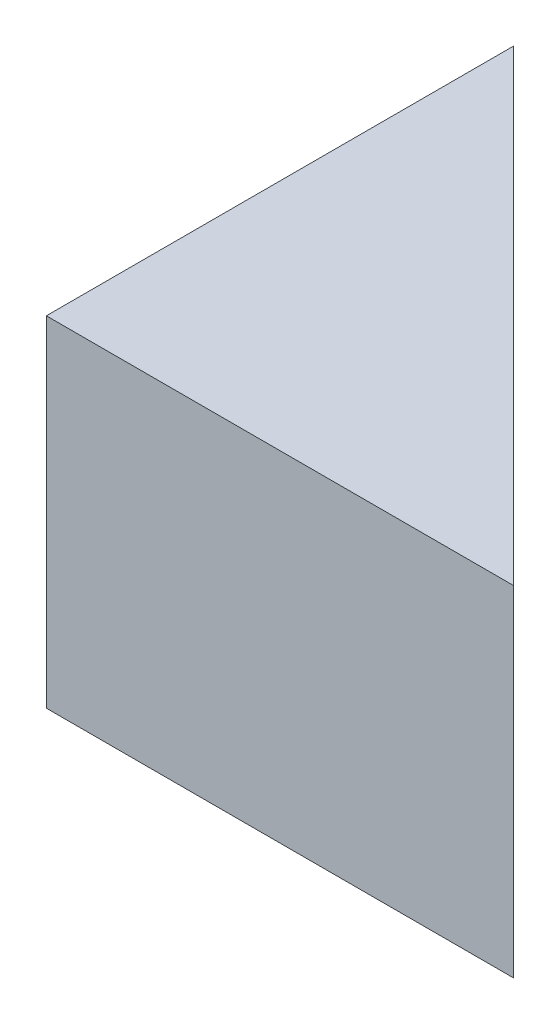
ISO-10303-21;
HEADER;
FILE_DESCRIPTION(('STEP AP214'),'2;1');
FILE_NAME('part.step','',(''),(''),'','','');
FILE_SCHEMA(('AUTOMOTIVE_DESIGN { 1 0 10303 214 1 1 1 1 }'));
ENDSEC;
DATA;
#1=APPLICATION_CONTEXT('core data for automotive mechanical design processes');
#2=APPLICATION_PROTOCOL_DEFINITION('international standard','automotive_design',2000,#1);
#3=PRODUCT_CONTEXT('',#1,'mechanical');
#4=PRODUCT('Part','Part','',(#3));
#5=PRODUCT_RELATED_PRODUCT_CATEGORY('part','',(#4));
#6=PRODUCT_DEFINITION_FORMATION('','',#4);
#7=PRODUCT_DEFINITION_CONTEXT('part definition',#1,'design');
#8=PRODUCT_DEFINITION('design','',#6,#7);
#9=PRODUCT_DEFINITION_SHAPE('','',#8);
#10=(LENGTH_UNIT() NAMED_UNIT(*) SI_UNIT(.MILLI.,.METRE.));
#11=(NAMED_UNIT(*) PLANE_ANGLE_UNIT() SI_UNIT($,.RADIAN.));
#12=(NAMED_UNIT(*) SI_UNIT($,.STERADIAN.) SOLID_ANGLE_UNIT());
#13=UNCERTAINTY_MEASURE_WITH_UNIT(LENGTH_MEASURE(1.E-05),#10,'distance_accuracy_value','');
#14=(GEOMETRIC_REPRESENTATION_CONTEXT(3) GLOBAL_UNCERTAINTY_ASSIGNED_CONTEXT((#13)) GLOBAL_UNIT_ASSIGNED_CONTEXT((#10,
#11,#12)) REPRESENTATION_CONTEXT('',''));
#15=CARTESIAN_POINT('',(0.,0.,0.));
#16=DIRECTION('',(0.,0.,1.));
#17=DIRECTION('',(1.,0.,0.));
#18=AXIS2_PLACEMENT_3D('',#15,#16,#17);
#19=CARTESIAN_POINT('',(27.5,20.,0.));
#20=DIRECTION('',(0.,0.,-1.));
#21=DIRECTION('',(-1.,0.,0.));
#22=AXIS2_PLACEMENT_3D('',#19,#20,#21);
#23=PLANE('',#22);
#24=DIRECTION('',(1.,0.,0.));
#25=VECTOR('',#24,1.);
#26=CARTESIAN_POINT('',(27.5,0.,0.));
#27=LINE('',#26,#25);
#28=CARTESIAN_POINT('',(0.,0.,0.));
#29=VERTEX_POINT('',#28);
#30=CARTESIAN_POINT('',(27.5,0.,0.));
#31=VERTEX_POINT('',#30);
#32=EDGE_CURVE('E89',#29,#31,#27,.T.);
#33=ORIENTED_EDGE('',*,*,#32,.T.);
#34=DIRECTION('',(0.,-1.,0.));
#35=VECTOR('',#34,1.);
#36=CARTESIAN_POINT('',(27.5,20.,0.));
#37=LINE('',#36,#35);
#38=CARTESIAN_POINT('',(27.5,20.,0.));
#39=VERTEX_POINT('',#38);
#40=EDGE_CURVE('E11',#39,#31,#37,.T.);
#41=ORIENTED_EDGE('',*,*,#40,.F.);
#42=DIRECTION('',(1.,0.,0.));
#43=VECTOR('',#42,1.);
#44=CARTESIAN_POINT('',(27.5,20.,0.));
#45=LINE('',#44,#43);
#46=CARTESIAN_POINT('',(0.,20.,0.));
#47=VERTEX_POINT('',#46);
#48=EDGE_CURVE('E81',#47,#39,#45,.T.);
#49=ORIENTED_EDGE('',*,*,#48,.F.);
#50=DIRECTION('',(0.,-1.,0.));
#51=VECTOR('',#50,1.);
#52=CARTESIAN_POINT('',(0.,20.,0.));
#53=LINE('',#52,#51);
#54=EDGE_CURVE('E90',#47,#29,#53,.T.);
#55=ORIENTED_EDGE('',*,*,#54,.T.);
#56=EDGE_LOOP('',(#33,#41,#49,#55));
#57=FACE_BOUND('',#56,.T.);
#58=ADVANCED_FACE('F39',(#57),#23,.F.);
#59=CARTESIAN_POINT('',(0.,20.,-27.5));
#60=DIRECTION('',(-0.707106781186548,0.,0.707106781186548));
#61=DIRECTION('',(0.707106781186548,0.,0.707106781186548));
#62=AXIS2_PLACEMENT_3D('',#59,#60,#61);
#63=PLANE('',#62);
#64=DIRECTION('',(-0.707106781186548,0.,-0.707106781186548));
#65=VECTOR('',#64,1.);
#66=CARTESIAN_POINT('',(0.,0.,-27.5));
#67=LINE('',#66,#65);
#68=CARTESIAN_POINT('',(0.,0.,-27.5));
#69=VERTEX_POINT('',#68);
#70=EDGE_CURVE('E68',#31,#69,#67,.T.);
#71=ORIENTED_EDGE('',*,*,#70,.T.);
#72=DIRECTION('',(0.,-1.,0.));
#73=VECTOR('',#72,1.);
#74=CARTESIAN_POINT('',(0.,20.,-27.5));
#75=LINE('',#74,#73);
#76=CARTESIAN_POINT('',(0.,20.,-27.5));
#77=VERTEX_POINT('',#76);
#78=EDGE_CURVE('E48',#77,#69,#75,.T.);
#79=ORIENTED_EDGE('',*,*,#78,.F.);
#80=DIRECTION('',(-0.707106781186548,0.,-0.707106781186548));
#81=VECTOR('',#80,1.);
#82=CARTESIAN_POINT('',(0.,20.,-27.5));
#83=LINE('',#82,#81);
#84=EDGE_CURVE('E76',#39,#77,#83,.T.);
#85=ORIENTED_EDGE('',*,*,#84,.F.);
#86=ORIENTED_EDGE('',*,*,#40,.T.);
#87=EDGE_LOOP('',(#71,#79,#85,#86));
#88=FACE_BOUND('',#87,.T.);
#89=ADVANCED_FACE('F77',(#88),#63,.F.);
#90=CARTESIAN_POINT('',(0.,20.,0.));
#91=DIRECTION('',(1.,0.,0.));
#92=DIRECTION('',(0.,0.,-1.));
#93=AXIS2_PLACEMENT_3D('',#90,#91,#92);
#94=PLANE('',#93);
#95=DIRECTION('',(0.,0.,1.));
#96=VECTOR('',#95,1.);
#97=CARTESIAN_POINT('',(0.,0.,0.));
#98=LINE('',#97,#96);
#99=EDGE_CURVE('E73',#69,#29,#98,.T.);
#100=ORIENTED_EDGE('',*,*,#99,.T.);
#101=ORIENTED_EDGE('',*,*,#54,.F.);
#102=DIRECTION('',(0.,0.,1.));
#103=VECTOR('',#102,1.);
#104=CARTESIAN_POINT('',(0.,20.,0.));
#105=LINE('',#104,#103);
#106=EDGE_CURVE('E56',#77,#47,#105,.T.);
#107=ORIENTED_EDGE('',*,*,#106,.F.);
#108=ORIENTED_EDGE('',*,*,#78,.T.);
#109=EDGE_LOOP('',(#100,#101,#107,#108));
#110=FACE_BOUND('',#109,.T.);
#111=ADVANCED_FACE('F102',(#110),#94,.F.);
#112=CARTESIAN_POINT('',(0.,20.,0.));
#113=DIRECTION('',(0.,-1.,0.));
#114=DIRECTION('',(0.,0.,-1.));
#115=AXIS2_PLACEMENT_3D('',#112,#113,#114);
#116=PLANE('',#115);
#117=ORIENTED_EDGE('',*,*,#48,.T.);
#118=ORIENTED_EDGE('',*,*,#84,.T.);
#119=ORIENTED_EDGE('',*,*,#106,.T.);
#120=EDGE_LOOP('',(#117,#118,#119));
#121=FACE_BOUND('',#120,.T.);
#122=ADVANCED_FACE('F84',(#121),#116,.F.);
#123=CARTESIAN_POINT('',(0.,0.,0.));
#124=DIRECTION('',(0.,-1.,0.));
#125=DIRECTION('',(0.,0.,-1.));
#126=AXIS2_PLACEMENT_3D('',#123,#124,#125);
#127=PLANE('',#126);
#128=ORIENTED_EDGE('',*,*,#32,.F.);
#129=ORIENTED_EDGE('',*,*,#99,.F.);
#130=ORIENTED_EDGE('',*,*,#70,.F.);
#131=EDGE_LOOP('',(#128,#129,#130));
#132=FACE_BOUND('',#131,.T.);
#133=ADVANCED_FACE('F103',(#132),#127,.T.);
#134=CLOSED_SHELL('',(#58,#89,#111,#122,#133));
#135=MANIFOLD_SOLID_BREP('B2',#134);
#136=ADVANCED_BREP_SHAPE_REPRESENTATION('',(#18,#135),#14);
#137=SHAPE_DEFINITION_REPRESENTATION(#9,#136);
ENDSEC;
END-ISO-10303-21;
